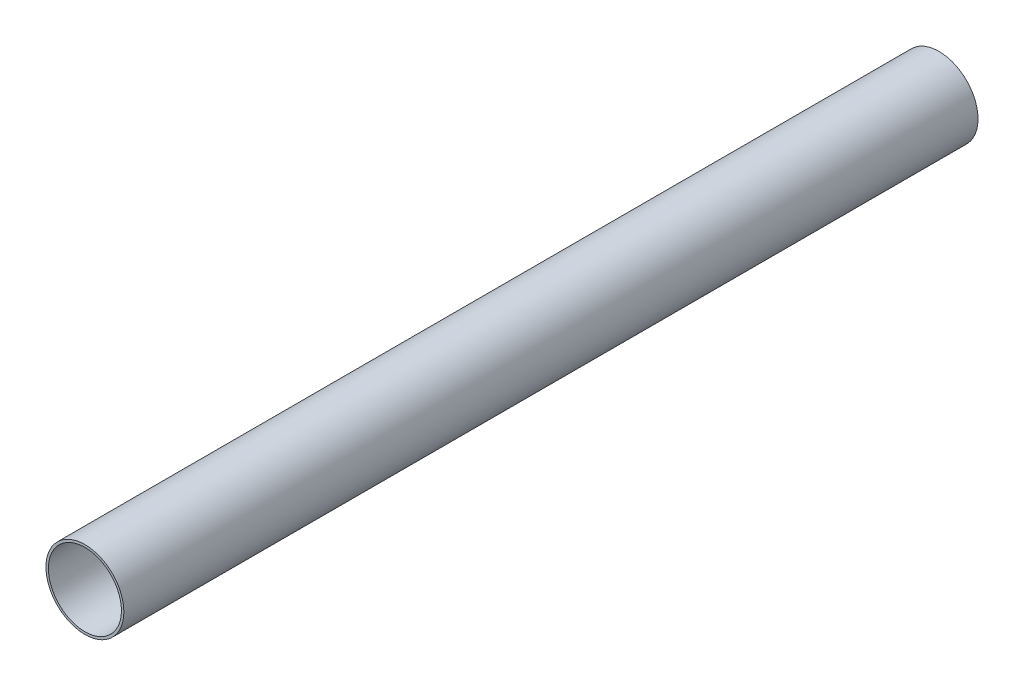
ISO-10303-21;
HEADER;
FILE_DESCRIPTION(('STEP AP214'),'2;1');
FILE_NAME('part.step','',(''),(''),'','','');
FILE_SCHEMA(('AUTOMOTIVE_DESIGN { 1 0 10303 214 1 1 1 1 }'));
ENDSEC;
DATA;
#1=APPLICATION_CONTEXT('core data for automotive mechanical design processes');
#2=APPLICATION_PROTOCOL_DEFINITION('international standard','automotive_design',2000,#1);
#3=PRODUCT_CONTEXT('',#1,'mechanical');
#4=PRODUCT('Part','Part','',(#3));
#5=PRODUCT_RELATED_PRODUCT_CATEGORY('part','',(#4));
#6=PRODUCT_DEFINITION_FORMATION('','',#4);
#7=PRODUCT_DEFINITION_CONTEXT('part definition',#1,'design');
#8=PRODUCT_DEFINITION('design','',#6,#7);
#9=PRODUCT_DEFINITION_SHAPE('','',#8);
#10=(LENGTH_UNIT() NAMED_UNIT(*) SI_UNIT(.MILLI.,.METRE.));
#11=(NAMED_UNIT(*) PLANE_ANGLE_UNIT() SI_UNIT($,.RADIAN.));
#12=(NAMED_UNIT(*) SI_UNIT($,.STERADIAN.) SOLID_ANGLE_UNIT());
#13=UNCERTAINTY_MEASURE_WITH_UNIT(LENGTH_MEASURE(1.E-05),#10,'distance_accuracy_value','');
#14=(GEOMETRIC_REPRESENTATION_CONTEXT(3) GLOBAL_UNCERTAINTY_ASSIGNED_CONTEXT((#13)) GLOBAL_UNIT_ASSIGNED_CONTEXT((#10,
#11,#12)) REPRESENTATION_CONTEXT('',''));
#15=CARTESIAN_POINT('',(0.,0.,0.));
#16=DIRECTION('',(0.,0.,1.));
#17=DIRECTION('',(1.,0.,0.));
#18=AXIS2_PLACEMENT_3D('',#15,#16,#17);
#19=CARTESIAN_POINT('',(0.,0.,278.375247287));
#20=DIRECTION('',(0.,0.,1.));
#21=DIRECTION('',(1.,0.,0.));
#22=AXIS2_PLACEMENT_3D('',#19,#20,#21);
#23=PLANE('',#22);
#24=CARTESIAN_POINT('',(0.,0.,278.375247287));
#25=DIRECTION('',(0.,0.,1.));
#26=DIRECTION('',(1.,0.,0.));
#27=AXIS2_PLACEMENT_3D('',#24,#25,#26);
#28=CIRCLE('',#27,25.4);
#29=CARTESIAN_POINT('',(25.4,0.,278.375247287));
#30=VERTEX_POINT('',#29);
#31=EDGE_CURVE('E10',#30,#30,#28,.T.);
#32=ORIENTED_EDGE('',*,*,#31,.T.);
#33=EDGE_LOOP('',(#32));
#34=FACE_BOUND('',#33,.T.);
#35=CARTESIAN_POINT('',(0.,0.,278.375247287));
#36=DIRECTION('',(0.,0.,1.));
#37=DIRECTION('',(1.,0.,0.));
#38=AXIS2_PLACEMENT_3D('',#35,#36,#37);
#39=CIRCLE('',#38,23.8125);
#40=CARTESIAN_POINT('',(23.8125,0.,278.375247287));
#41=VERTEX_POINT('',#40);
#42=EDGE_CURVE('E47',#41,#41,#39,.T.);
#43=ORIENTED_EDGE('',*,*,#42,.F.);
#44=EDGE_LOOP('',(#43));
#45=FACE_BOUND('',#44,.T.);
#46=ADVANCED_FACE('F36',(#34,#45),#23,.T.);
#47=CARTESIAN_POINT('',(0.,0.,-278.375247287));
#48=DIRECTION('',(0.,0.,1.));
#49=DIRECTION('',(1.,0.,0.));
#50=AXIS2_PLACEMENT_3D('',#47,#48,#49);
#51=PLANE('',#50);
#52=CARTESIAN_POINT('',(0.,0.,-278.375247287));
#53=DIRECTION('',(0.,0.,1.));
#54=DIRECTION('',(1.,0.,0.));
#55=AXIS2_PLACEMENT_3D('',#52,#53,#54);
#56=CIRCLE('',#55,25.4);
#57=CARTESIAN_POINT('',(25.4,0.,-278.375247287));
#58=VERTEX_POINT('',#57);
#59=EDGE_CURVE('E40',#58,#58,#56,.T.);
#60=ORIENTED_EDGE('',*,*,#59,.F.);
#61=EDGE_LOOP('',(#60));
#62=FACE_BOUND('',#61,.T.);
#63=CARTESIAN_POINT('',(0.,0.,-278.375247287));
#64=DIRECTION('',(0.,0.,1.));
#65=DIRECTION('',(1.,0.,0.));
#66=AXIS2_PLACEMENT_3D('',#63,#64,#65);
#67=CIRCLE('',#66,23.8125);
#68=CARTESIAN_POINT('',(23.8125,0.,-278.375247287));
#69=VERTEX_POINT('',#68);
#70=EDGE_CURVE('E49',#69,#69,#67,.T.);
#71=ORIENTED_EDGE('',*,*,#70,.T.);
#72=EDGE_LOOP('',(#71));
#73=FACE_BOUND('',#72,.T.);
#74=ADVANCED_FACE('F59',(#62,#73),#51,.F.);
#75=CARTESIAN_POINT('',(0.,0.,278.375247287));
#76=DIRECTION('',(0.,0.,-1.));
#77=DIRECTION('',(-1.,0.,0.));
#78=AXIS2_PLACEMENT_3D('',#75,#76,#77);
#79=CYLINDRICAL_SURFACE('',#78,25.4);
#80=ORIENTED_EDGE('',*,*,#31,.F.);
#81=EDGE_LOOP('',(#80));
#82=FACE_BOUND('',#81,.T.);
#83=ORIENTED_EDGE('',*,*,#59,.T.);
#84=EDGE_LOOP('',(#83));
#85=FACE_BOUND('',#84,.T.);
#86=ADVANCED_FACE('F38',(#82,#85),#79,.T.);
#87=CARTESIAN_POINT('',(0.,0.,278.375247287));
#88=DIRECTION('',(0.,0.,-1.));
#89=DIRECTION('',(-1.,0.,0.));
#90=AXIS2_PLACEMENT_3D('',#87,#88,#89);
#91=CYLINDRICAL_SURFACE('',#90,23.8125);
#92=ORIENTED_EDGE('',*,*,#42,.T.);
#93=EDGE_LOOP('',(#92));
#94=FACE_BOUND('',#93,.T.);
#95=ORIENTED_EDGE('',*,*,#70,.F.);
#96=EDGE_LOOP('',(#95));
#97=FACE_BOUND('',#96,.T.);
#98=ADVANCED_FACE('F55',(#94,#97),#91,.F.);
#99=CLOSED_SHELL('',(#46,#74,#86,#98));
#100=MANIFOLD_SOLID_BREP('B2',#99);
#101=ADVANCED_BREP_SHAPE_REPRESENTATION('',(#18,#100),#14);
#102=SHAPE_DEFINITION_REPRESENTATION(#9,#101);
ENDSEC;
END-ISO-10303-21;
